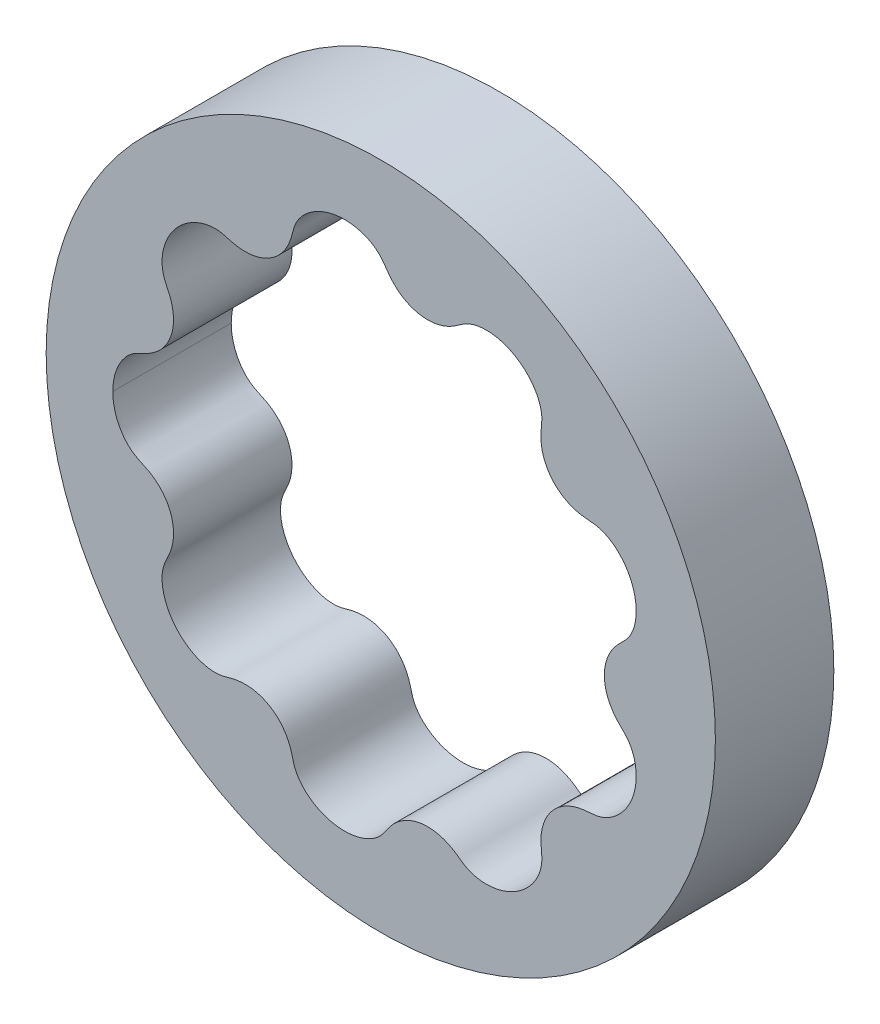
ISO-10303-21;
HEADER;
FILE_DESCRIPTION(('STEP AP214'),'2;1');
FILE_NAME('part.step','',(''),(''),'','','');
FILE_SCHEMA(('AUTOMOTIVE_DESIGN { 1 0 10303 214 1 1 1 1 }'));
ENDSEC;
DATA;
#1=APPLICATION_CONTEXT('core data for automotive mechanical design processes');
#2=APPLICATION_PROTOCOL_DEFINITION('international standard','automotive_design',2000,#1);
#3=PRODUCT_CONTEXT('',#1,'mechanical');
#4=PRODUCT('Part','Part','',(#3));
#5=PRODUCT_RELATED_PRODUCT_CATEGORY('part','',(#4));
#6=PRODUCT_DEFINITION_FORMATION('','',#4);
#7=PRODUCT_DEFINITION_CONTEXT('part definition',#1,'design');
#8=PRODUCT_DEFINITION('design','',#6,#7);
#9=PRODUCT_DEFINITION_SHAPE('','',#8);
#10=(LENGTH_UNIT() NAMED_UNIT(*) SI_UNIT(.MILLI.,.METRE.));
#11=(NAMED_UNIT(*) PLANE_ANGLE_UNIT() SI_UNIT($,.RADIAN.));
#12=(NAMED_UNIT(*) SI_UNIT($,.STERADIAN.) SOLID_ANGLE_UNIT());
#13=UNCERTAINTY_MEASURE_WITH_UNIT(LENGTH_MEASURE(1.E-05),#10,'distance_accuracy_value','');
#14=(GEOMETRIC_REPRESENTATION_CONTEXT(3) GLOBAL_UNCERTAINTY_ASSIGNED_CONTEXT((#13)) GLOBAL_UNIT_ASSIGNED_CONTEXT((#10,
#11,#12)) REPRESENTATION_CONTEXT('',''));
#15=CARTESIAN_POINT('',(0.,0.,0.));
#16=DIRECTION('',(0.,0.,1.));
#17=DIRECTION('',(1.,0.,0.));
#18=AXIS2_PLACEMENT_3D('',#15,#16,#17);
#19=CARTESIAN_POINT('',(0.,0.,4.));
#20=DIRECTION('',(0.,0.,1.));
#21=DIRECTION('',(1.,0.,0.));
#22=AXIS2_PLACEMENT_3D('',#19,#20,#21);
#23=PLANE('',#22);
#24=CARTESIAN_POINT('',(0.,0.,4.));
#25=DIRECTION('',(0.,0.,1.));
#26=DIRECTION('',(1.,0.,0.));
#27=AXIS2_PLACEMENT_3D('',#24,#25,#26);
#28=CIRCLE('',#27,11.3);
#29=CARTESIAN_POINT('',(11.3,0.,4.));
#30=VERTEX_POINT('',#29);
#31=EDGE_CURVE('E11',#30,#30,#28,.T.);
#32=ORIENTED_EDGE('',*,*,#31,.T.);
#33=EDGE_LOOP('',(#32));
#34=FACE_BOUND('',#33,.T.);
#35=CARTESIAN_POINT('',(-9.05,4.34208598569843E-12,4.));
#36=CARTESIAN_POINT('',(-9.05000000000009,-0.0338845457485466,4.));
#37=CARTESIAN_POINT('',(-9.0480108330893,-0.0999754638575466,4.));
#38=CARTESIAN_POINT('',(-9.03849618641108,-0.253381349152992,4.));
#39=CARTESIAN_POINT('',(-9.01161834121665,-0.402056601440044,4.));
#40=CARTESIAN_POINT('',(-8.96818608965087,-0.584253865791187,4.));
#41=CARTESIAN_POINT('',(-8.90628150530137,-0.753480861616977,4.));
#42=CARTESIAN_POINT('',(-8.82464560083271,-0.928393679765872,4.));
#43=CARTESIAN_POINT('',(-8.72205328204634,-1.09550990602707,4.));
#44=CARTESIAN_POINT('',(-8.59255305961778,-1.25815337939472,4.));
#45=CARTESIAN_POINT('',(-8.43427689913171,-1.40817021879999,4.));
#46=CARTESIAN_POINT('',(-8.22379434202984,-1.54385861169105,4.));
#47=CARTESIAN_POINT('',(-7.96175769623347,-1.64361375906756,4.));
#48=CARTESIAN_POINT('',(-7.67491557586151,-1.80488701473293,4.));
#49=CARTESIAN_POINT('',(-7.38880714459647,-2.05246447300622,4.));
#50=CARTESIAN_POINT('',(-7.16387052284104,-2.37305520053106,4.));
#51=CARTESIAN_POINT('',(-7.02294453567574,-2.75014551002979,4.));
#52=CARTESIAN_POINT('',(-6.98370366084114,-3.11056598882183,4.));
#53=CARTESIAN_POINT('',(-7.01650645467619,-3.43029150072726,4.));
#54=CARTESIAN_POINT('',(-7.08818605320103,-3.67823618533869,4.));
#55=CARTESIAN_POINT('',(-7.16312462348558,-3.85880815844515,4.));
#56=CARTESIAN_POINT('',(-7.2500269078327,-4.0339149857726,4.));
#57=CARTESIAN_POINT('',(-7.34496135371445,-4.23988161683626,4.));
#58=CARTESIAN_POINT('',(-7.40485279120046,-4.55150918978985,4.));
#59=CARTESIAN_POINT('',(-7.37966982275361,-4.92997010947759,4.));
#60=CARTESIAN_POINT('',(-7.25886645405434,-5.32011743441312,4.));
#61=CARTESIAN_POINT('',(-7.05984177791175,-5.67488836434194,4.));
#62=CARTESIAN_POINT('',(-6.8146038549447,-5.96715365862774,4.));
#63=CARTESIAN_POINT('',(-6.49978012510001,-6.22475847184485,4.));
#64=CARTESIAN_POINT('',(-6.1365416607677,-6.41147671768762,4.));
#65=CARTESIAN_POINT('',(-5.76819685028252,-6.50199385185095,4.));
#66=CARTESIAN_POINT('',(-5.45091280943954,-6.4971288982848,4.));
#67=CARTESIAN_POINT('',(-5.2315757924767,-6.43939791211182,4.));
#68=CARTESIAN_POINT('',(-5.04406860228578,-6.38423217623337,4.));
#69=CARTESIAN_POINT('',(-4.853163254691,-6.34176822433269,4.));
#70=CARTESIAN_POINT('',(-4.59664492576909,-6.31426590279636,4.));
#71=CARTESIAN_POINT('',(-4.27592450333769,-6.33743270329501,4.));
#72=CARTESIAN_POINT('',(-3.93716764740486,-6.43607692048365,4.));
#73=CARTESIAN_POINT('',(-3.60522228785027,-6.62772565796741,4.));
#74=CARTESIAN_POINT('',(-3.35041546705783,-6.87177560091479,4.));
#75=CARTESIAN_POINT('',(-3.16999221076395,-7.13794422226942,4.));
#76=CARTESIAN_POINT('',(-3.06555076730631,-7.3738467911592,4.));
#77=CARTESIAN_POINT('',(-3.00687293362705,-7.5604076150529,4.));
#78=CARTESIAN_POINT('',(-2.96089430468505,-7.75037653148983,4.));
#79=CARTESIAN_POINT('',(-2.90122223151202,-7.96919335153971,4.));
#80=CARTESIAN_POINT('',(-2.74679349993018,-8.2464020477215,4.));
#81=CARTESIAN_POINT('',(-2.48423076735979,-8.52013914852142,4.));
#82=CARTESIAN_POINT('',(-2.14090909672855,-8.74135423950637,4.));
#83=CARTESIAN_POINT('',(-1.76040443238665,-8.88519642226108,4.));
#84=CARTESIAN_POINT('',(-1.38467709910732,-8.95144728852439,4.));
#85=CARTESIAN_POINT('',(-0.977922749887494,-8.94642011062799,4.));
#86=CARTESIAN_POINT('',(-0.579645892311698,-8.8559688490739,4.));
#87=CARTESIAN_POINT('',(-0.239294027580617,-8.68854185876272,4.));
#88=CARTESIAN_POINT('',(0.000632469936170721,-8.48086862956355,4.));
#89=CARTESIAN_POINT('',(0.131545636898317,-8.29565712930711,4.));
#90=CARTESIAN_POINT('',(0.239724611301174,-8.13287035796854,4.));
#91=CARTESIAN_POINT('',(0.358671298243356,-7.97762952875283,4.));
#92=CARTESIAN_POINT('',(0.537497582550544,-7.79167470427905,4.));
#93=CARTESIAN_POINT('',(0.79807501489091,-7.60326640099559,4.));
#94=CARTESIAN_POINT('',(1.12098510094963,-7.4610835387521,4.));
#95=CARTESIAN_POINT('',(1.49845943391574,-7.3945246293248,4.));
#96=CARTESIAN_POINT('',(1.85052506188594,-7.41769106186328,4.));
#97=CARTESIAN_POINT('',(2.15982718709108,-7.5056142233956,4.));
#98=CARTESIAN_POINT('',(2.39146922257779,-7.61919240836647,4.));
#99=CARTESIAN_POINT('',(2.55633803721866,-7.72438890710487,4.));
#100=CARTESIAN_POINT('',(2.71366937606111,-7.84035904657062,4.));
#101=CARTESIAN_POINT('',(2.90003357686985,-7.96962598650576,4.));
#102=CARTESIAN_POINT('',(3.19651916375521,-8.08271529247329,4.));
#103=CARTESIAN_POINT('',(3.57360870270002,-8.12363800619546,4.));
#104=CARTESIAN_POINT('',(3.97880268029327,-8.07241568136682,4.));
#105=CARTESIAN_POINT('',(4.36274613673875,-7.93802150242619,4.));
#106=CARTESIAN_POINT('',(4.69315520862735,-7.7472597360533,4.));
#107=CARTESIAN_POINT('',(5.00151570965813,-7.48195203825989,4.));
#108=CARTESIAN_POINT('',(5.24847253342773,-7.15665492310951,4.));
#109=CARTESIAN_POINT('',(5.40157719257482,-6.80962444532587,4.));
#110=CARTESIAN_POINT('',(5.4518817750752,-6.49631574320234,4.));
#111=CARTESIAN_POINT('',(5.4331154201998,-6.27028613951449,4.));
#112=CARTESIAN_POINT('',(5.41134800574038,-6.0760481365708,4.));
#113=CARTESIAN_POINT('',(5.40267956638729,-5.88066929893342,4.));
#114=CARTESIAN_POINT('',(5.4201390013375,-5.62327233003758,4.));
#115=CARTESIAN_POINT('',(5.49864635662003,-5.31144723525566,4.));
#116=CARTESIAN_POINT('',(5.65461647568074,-4.99496626597723,4.));
#117=CARTESIAN_POINT('',(5.90099531095603,-4.70134332075604,4.));
#118=CARTESIAN_POINT('',(6.1855843842221,-4.4927864748549,4.));
#119=CARTESIAN_POINT('',(6.47903937794905,-4.36132384924646,4.));
#120=CARTESIAN_POINT('',(6.7294942961724,-4.29943333371457,4.));
#121=CARTESIAN_POINT('',(6.92340982368915,-4.27404257217982,4.));
#122=CARTESIAN_POINT('',(7.11847736507471,-4.26175080301141,4.));
#123=CARTESIAN_POINT('',(7.34433080736584,-4.24098140233228,4.));
#124=CARTESIAN_POINT('',(7.64414612926106,-4.13703738102555,4.));
#125=CARTESIAN_POINT('',(7.95931515564262,-3.92599456019099,4.));
#126=CARTESIAN_POINT('',(8.23679143100652,-3.62630702822289,4.));
#127=CARTESIAN_POINT('',(8.44322684601852,-3.27872194257295,4.));
#128=CARTESIAN_POINT('',(8.57256056481669,-2.92522878255192,4.));
#129=CARTESIAN_POINT('',(8.63998002290509,-2.52542727922476,4.));
#130=CARTESIAN_POINT('',(8.62280091236429,-2.1212000603798,4.));
#131=CARTESIAN_POINT('',(8.52117396998677,-1.76029674907265,4.));
#132=CARTESIAN_POINT('',(8.3634633135826,-1.48950364190572,4.));
#133=CARTESIAN_POINT('',(8.21390626106284,-1.33110870093092,4.));
#134=CARTESIAN_POINT('',(8.07436723837733,-1.19947756070688,4.));
#135=CARTESIAN_POINT('',(7.93834343482174,-1.05611945374247,4.));
#136=CARTESIAN_POINT('',(7.80974701267406,-0.886363911294823,4.));
#137=CARTESIAN_POINT('',(7.69959982716471,-0.686174715248969,4.));
#138=CARTESIAN_POINT('',(7.63179107421368,-0.513440089414267,4.));
#139=CARTESIAN_POINT('',(7.59278548068211,-0.374358830302239,4.));
#140=CARTESIAN_POINT('',(7.56916783899256,-0.254768484757351,4.));
#141=CARTESIAN_POINT('',(7.55603575821335,-0.154882157840738,4.));
#142=CARTESIAN_POINT('',(7.55109737708745,-0.0666034399658314,4.));
#143=CARTESIAN_POINT('',(7.55000000000025,-0.0222174664717109,4.));
#144=CARTESIAN_POINT('',(7.55,-1.3359856241198E-11,4.));
#145=B_SPLINE_CURVE_WITH_KNOTS('',4,(#35,#36,#37,#38,#39,#40,#41,#42,#43,#44,#45,#46,#47,#48,
#49,#50,#51,#52,#53,#54,#55,#56,#57,#58,#59,#60,#61,#62,#63,#64,#65,#66,#67,#68,#69,#70,#71,#72,
#73,#74,#75,#76,#77,#78,#79,#80,#81,#82,#83,#84,#85,#86,#87,#88,#89,#90,#91,#92,#93,#94,#95,#96,
#97,#98,#99,#100,#101,#102,#103,#104,#105,#106,#107,#108,#109,#110,#111,#112,#113,#114,#115,
#116,#117,#118,#119,#120,#121,#122,#123,#124,#125,#126,#127,#128,#129,#130,#131,#132,#133,#134,
#135,#136,#137,#138,#139,#140,#141,#142,#143,#144),.UNSPECIFIED.,.F.,.F.,(5,1,1,1,1,1,1,1,1,1,1,
1,1,1,1,1,1,1,1,1,1,1,1,1,1,1,1,1,1,1,1,1,1,1,1,1,1,1,1,1,1,1,1,1,1,1,1,1,1,1,1,1,1,1,1,1,1,1,1,
1,1,1,1,1,1,1,1,1,1,1,1,1,1,1,1,1,1,1,1,1,1,1,1,1,1,1,1,1,1,1,1,1,1,1,1,1,1,1,1,1,1,1,1,1,1,1,
5),(0.0652033425962136,0.0696067762717131,0.0740102099472127,0.0792347884678217,
0.0844593669884307,0.0896839455090396,0.0949085240296486,0.100807291678031,0.106706059326413,
0.113107795366628,0.119509531406844,0.128934262178931,0.138358992951017,0.150165223947531,
0.161982616798153,0.172732891824195,0.183462449964343,0.190799304051377,0.198136158138412,
0.201842380228175,0.205548602317939,0.212961046497466,0.223694446923218,0.237304279166519,
0.248033097158145,0.258761915149772,0.269490733141396,0.28021955113302,0.293829383376316,
0.304562783802064,0.311975227981587,0.315681450071349,0.319387672161111,0.326724526248143,
0.334061380335175,0.344790938475318,0.355541213501353,0.366291488527385,0.377021046667528,
0.384357900754559,0.391694754841591,0.395400976931353,0.399107199021114,0.406519643200637,
0.417253043626384,0.430862875869679,0.4415916938613,0.452320511852922,0.463049329844543,
0.473778147836164,0.48738798007946,0.498121380505208,0.505533824684732,0.509240046774494,
0.512946268864256,0.520283122951288,0.52761997703832,0.538349535178464,0.549099810204498,
0.559850085230529,0.57057964337067,0.577916497457702,0.585253351544733,0.588959573634495,
0.592665795724256,0.600078239903779,0.610811640329526,0.62442147257282,0.635150290564441,
0.645879108556062,0.656607926547684,0.667336744539306,0.680946576782601,0.691679977208348,
0.699092421387871,0.702798643477633,0.706504865567395,0.713841719654426,0.721178573741458,
0.731908131881601,0.742658406907635,0.753408681933668,0.764138240073811,0.771475094160842,
0.778811948247874,0.782518170337635,0.786224392427397,0.79363683660692,0.804370237032666,
0.817980069275961,0.828708887267582,0.839437705259203,0.849882621646104,0.860327538033005,
0.874366170725934,0.884812242774694,0.891865721209106,0.895392460426312,0.898919199643518,
0.906554070350569,0.914188941057619,0.919428463542016,0.924667986026414,0.927555235592,
0.930442485157586,0.933329734723172,0.936216984288758),.UNSPECIFIED.);
#146=CARTESIAN_POINT('',(-9.05,4.34208598569843E-12,4.));
#147=VERTEX_POINT('',#146);
#148=CARTESIAN_POINT('',(7.55,-1.3359856241198E-11,4.));
#149=VERTEX_POINT('',#148);
#150=EDGE_CURVE('E76',#147,#149,#145,.T.);
#151=ORIENTED_EDGE('',*,*,#150,.F.);
#152=CARTESIAN_POINT('',(7.55,0.,4.));
#153=CARTESIAN_POINT('',(7.55000000000027,0.022217466458351,4.));
#154=CARTESIAN_POINT('',(7.55109737708752,0.0666034399524704,4.));
#155=CARTESIAN_POINT('',(7.55603575821352,0.154882157827372,4.));
#156=CARTESIAN_POINT('',(7.56916783899283,0.254768484743971,4.));
#157=CARTESIAN_POINT('',(7.5927854806825,0.374358830288833,4.));
#158=CARTESIAN_POINT('',(7.63179107421422,0.51344008940082,4.));
#159=CARTESIAN_POINT('',(7.69959982716544,0.68617471523545,4.));
#160=CARTESIAN_POINT('',(7.80974701267501,0.886363911281186,4.));
#161=CARTESIAN_POINT('',(7.93834343482286,1.0561194537287,4.));
#162=CARTESIAN_POINT('',(8.0743672383786,1.19947756069296,4.));
#163=CARTESIAN_POINT('',(8.21390626106425,1.33110870091685,4.));
#164=CARTESIAN_POINT('',(8.36346331358419,1.4895036418915,4.));
#165=CARTESIAN_POINT('',(8.52117396998865,1.76029674905826,4.));
#166=CARTESIAN_POINT('',(8.62280091236655,2.12120006036529,4.));
#167=CARTESIAN_POINT('',(8.63998002290779,2.52542727921024,4.));
#168=CARTESIAN_POINT('',(8.57256056481981,2.92522878253747,4.));
#169=CARTESIAN_POINT('',(8.44322684602201,3.27872194255863,4.));
#170=CARTESIAN_POINT('',(8.23679143101039,3.62630702820879,4.));
#171=CARTESIAN_POINT('',(7.95931515564681,3.92599456017719,4.));
#172=CARTESIAN_POINT('',(7.64414612926547,4.13703738101209,4.));
#173=CARTESIAN_POINT('',(7.34433080737036,4.24098140231914,4.));
#174=CARTESIAN_POINT('',(7.11847736507926,4.26175080299851,4.));
#175=CARTESIAN_POINT('',(6.92340982369371,4.27404257216713,4.));
#176=CARTESIAN_POINT('',(6.72949429617699,4.29943333370208,4.));
#177=CARTESIAN_POINT('',(6.4790393779537,4.36132384923424,4.));
#178=CARTESIAN_POINT('',(6.18558438422689,4.49278647484299,4.));
#179=CARTESIAN_POINT('',(5.90099531096105,4.70134332074444,4.));
#180=CARTESIAN_POINT('',(5.65461647568606,4.99496626596589,4.));
#181=CARTESIAN_POINT('',(5.49864635662569,5.31144723524449,4.));
#182=CARTESIAN_POINT('',(5.4201390013435,5.62327233002649,4.));
#183=CARTESIAN_POINT('',(5.40267956639356,5.88066929892235,4.));
#184=CARTESIAN_POINT('',(5.41134800574686,6.07604813655972,4.));
#185=CARTESIAN_POINT('',(5.43311542020648,6.27028613950339,4.));
#186=CARTESIAN_POINT('',(5.45188177508213,6.49631574319122,4.));
#187=CARTESIAN_POINT('',(5.40157719258208,6.8096244453148,4.));
#188=CARTESIAN_POINT('',(5.24847253343536,7.1566549230986,4.));
#189=CARTESIAN_POINT('',(5.0015157096661,7.48195203824925,4.));
#190=CARTESIAN_POINT('',(4.69315520863561,7.74725973604298,4.));
#191=CARTESIAN_POINT('',(4.36274613674722,7.93802150241623,4.));
#192=CARTESIAN_POINT('',(3.97880268030188,8.07241568135727,4.));
#193=CARTESIAN_POINT('',(3.57360870270868,8.12363800618634,4.));
#194=CARTESIAN_POINT('',(3.19651916376383,8.08271529246457,4.));
#195=CARTESIAN_POINT('',(2.90003357687835,7.96962598649736,4.));
#196=CARTESIAN_POINT('',(2.71366937606947,7.84035904656242,4.));
#197=CARTESIAN_POINT('',(2.5563380372269,7.72438890709684,4.));
#198=CARTESIAN_POINT('',(2.39146922258591,7.61919240835861,4.));
#199=CARTESIAN_POINT('',(2.15982718709908,7.50561422338799,4.));
#200=CARTESIAN_POINT('',(1.85052506189385,7.41769106185599,4.));
#201=CARTESIAN_POINT('',(1.49845943392362,7.3945246293179,4.));
#202=CARTESIAN_POINT('',(1.12098510095759,7.4610835387456,4.));
#203=CARTESIAN_POINT('',(0.798075014899017,7.60326640098943,4.));
#204=CARTESIAN_POINT('',(0.537497582558851,7.79167470427317,4.));
#205=CARTESIAN_POINT('',(0.358671298251862,7.97762952874714,4.));
#206=CARTESIAN_POINT('',(0.239724611309845,8.13287035796297,4.));
#207=CARTESIAN_POINT('',(0.131545636907162,8.29565712930166,4.));
#208=CARTESIAN_POINT('',(0.000632469945212832,8.48086862955824,4.));
#209=CARTESIAN_POINT('',(-0.239294027571354,8.68854185875767,4.));
#210=CARTESIAN_POINT('',(-0.579645892302256,8.85596884906921,4.));
#211=CARTESIAN_POINT('',(-0.977922749877955,8.94642011062372,4.));
#212=CARTESIAN_POINT('',(-1.38467709909778,8.95144728852055,4.));
#213=CARTESIAN_POINT('',(-1.76040443237717,8.88519642225764,4.));
#214=CARTESIAN_POINT('',(-2.14090909671924,8.74135423950334,4.));
#215=CARTESIAN_POINT('',(-2.4842307673507,8.52013914851876,4.));
#216=CARTESIAN_POINT('',(-2.74679349992139,8.24640204771912,4.));
#217=CARTESIAN_POINT('',(-2.90122223150353,7.9691933515375,4.));
#218=CARTESIAN_POINT('',(-2.96089430467679,7.75037653148768,4.));
#219=CARTESIAN_POINT('',(-3.00687293361899,7.5604076150508,4.));
#220=CARTESIAN_POINT('',(-3.06555076729845,7.37384679115716,4.));
#221=CARTESIAN_POINT('',(-3.16999221075634,7.13794422226749,4.));
#222=CARTESIAN_POINT('',(-3.3504154670505,6.87177560091305,4.));
#223=CARTESIAN_POINT('',(-3.60522228784321,6.62772565796595,4.));
#224=CARTESIAN_POINT('',(-3.937167647398,6.43607692048254,4.));
#225=CARTESIAN_POINT('',(-4.27592450333094,6.33743270329426,4.));
#226=CARTESIAN_POINT('',(-4.59664492576236,6.31426590279595,4.));
#227=CARTESIAN_POINT('',(-4.85316325468424,6.34176822433256,4.));
#228=CARTESIAN_POINT('',(-5.04406860227897,6.38423217623344,4.));
#229=CARTESIAN_POINT('',(-5.23157579246983,6.43939791211209,4.));
#230=CARTESIAN_POINT('',(-5.45091280943261,6.49712889828531,4.));
#231=CARTESIAN_POINT('',(-5.76819685027559,6.50199385185179,4.));
#232=CARTESIAN_POINT('',(-6.13654166076087,6.41147671768886,4.));
#233=CARTESIAN_POINT('',(-6.49978012509337,6.22475847184648,4.));
#234=CARTESIAN_POINT('',(-6.81460385493834,5.9671536586297,4.));
#235=CARTESIAN_POINT('',(-7.0598417779057,5.67488836434416,4.));
#236=CARTESIAN_POINT('',(-7.25886645404867,5.32011743441555,4.));
#237=CARTESIAN_POINT('',(-7.37966982274836,4.92997010948015,4.));
#238=CARTESIAN_POINT('',(-7.40485279119561,4.55150918979244,4.));
#239=CARTESIAN_POINT('',(-7.34496135370993,4.23988161683878,4.));
#240=CARTESIAN_POINT('',(-7.2500269078284,4.03391498577502,4.));
#241=CARTESIAN_POINT('',(-7.16312462348147,3.85880815844748,4.));
#242=CARTESIAN_POINT('',(-7.08818605319711,3.67823618534094,4.));
#243=CARTESIAN_POINT('',(-7.01650645467254,3.43029150072943,4.));
#244=CARTESIAN_POINT('',(-6.98370366083783,3.11056598882397,4.));
#245=CARTESIAN_POINT('',(-7.02294453567281,2.75014551003197,4.));
#246=CARTESIAN_POINT('',(-7.16387052283851,2.3730552005334,4.));
#247=CARTESIAN_POINT('',(-7.38880714459428,2.05246447300879,4.));
#248=CARTESIAN_POINT('',(-7.67491557585959,1.80488701473581,4.));
#249=CARTESIAN_POINT('',(-7.96175769623171,1.64361375907074,4.));
#250=CARTESIAN_POINT('',(-8.2237943420282,1.54385861169451,4.));
#251=CARTESIAN_POINT('',(-8.43427689913021,1.40817021880368,4.));
#252=CARTESIAN_POINT('',(-8.59255305961644,1.25815337939858,4.));
#253=CARTESIAN_POINT('',(-8.72205328204517,1.09550990603106,4.));
#254=CARTESIAN_POINT('',(-8.82464560083173,0.928393679769974,4.));
#255=CARTESIAN_POINT('',(-8.90628150530056,0.753480861621166,4.));
#256=CARTESIAN_POINT('',(-8.96818608965025,0.584253865795442,4.));
#257=CARTESIAN_POINT('',(-9.01161834121622,0.402056601444345,4.));
#258=CARTESIAN_POINT('',(-9.03849618641081,0.253381349157321,4.));
#259=CARTESIAN_POINT('',(-9.0480108330892,0.0999754638618866,4.));
#260=CARTESIAN_POINT('',(-9.05000000000006,0.0338845457528887,4.));
#261=CARTESIAN_POINT('',(-9.05,0.,4.));
#262=B_SPLINE_CURVE_WITH_KNOTS('',4,(#152,#153,#154,#155,#156,#157,#158,#159,#160,#161,#162,
#163,#164,#165,#166,#167,#168,#169,#170,#171,#172,#173,#174,#175,#176,#177,#178,#179,#180,#181,
#182,#183,#184,#185,#186,#187,#188,#189,#190,#191,#192,#193,#194,#195,#196,#197,#198,#199,#200,
#201,#202,#203,#204,#205,#206,#207,#208,#209,#210,#211,#212,#213,#214,#215,#216,#217,#218,#219,
#220,#221,#222,#223,#224,#225,#226,#227,#228,#229,#230,#231,#232,#233,#234,#235,#236,#237,#238,
#239,#240,#241,#242,#243,#244,#245,#246,#247,#248,#249,#250,#251,#252,#253,#254,#255,#256,#257,
#258,#259,#260,#261),.UNSPECIFIED.,.F.,.F.,(5,1,1,1,1,1,1,1,1,1,1,1,1,1,1,1,1,1,1,1,1,1,1,1,1,1,
1,1,1,1,1,1,1,1,1,1,1,1,1,1,1,1,1,1,1,1,1,1,1,1,1,1,1,1,1,1,1,1,1,1,1,1,1,1,1,1,1,1,1,1,1,1,1,1,
1,1,1,1,1,1,1,1,1,1,1,1,1,1,1,1,1,1,1,1,1,1,1,1,1,1,1,1,1,1,1,1,5),(0.0652033425962136,
0.0680905921617996,0.0709778417273857,0.0738650912929718,0.0767523408585578,0.0819918633429553,
0.0872313858273528,0.094866256534403,0.102501127241453,0.106027866458659,0.109554605675866,
0.116608084110278,0.127054156159038,0.141092788851966,0.151537705238868,0.161982621625769,
0.17271143961739,0.183440257609011,0.197050089852305,0.207783490278052,0.215195934457575,
0.218902156547336,0.222608378637098,0.229945232724129,0.237282086811161,0.248011644951303,
0.258761919977337,0.269512195003371,0.280241753143513,0.287578607230545,0.294915461317577,
0.298621683407339,0.3023279054971,0.309740349676624,0.320473750102371,0.334083582345666,
0.344812400337288,0.35554121832891,0.36627003632053,0.376998854312151,0.390608686555446,
0.401342086981192,0.408754531160715,0.412460753250477,0.416166975340238,0.42350382942727,
0.430840683514301,0.441570241654443,0.452320516680474,0.463070791706508,0.473800349846651,
0.481137203933684,0.488474058020716,0.492180280110478,0.49588650220024,0.503298946379764,
0.514032346805512,0.527642179048808,0.538370997040429,0.54909981503205,0.559828633023671,
0.570557451015293,0.584167283258587,0.594900683684334,0.602313127863857,0.606019349953619,
0.609725572043381,0.617062426130412,0.624399280217444,0.635128838357586,0.645879113383619,
0.656629388409653,0.667358946549796,0.674695800636828,0.682032654723861,0.685738876813622,
0.689445098903384,0.696857543082908,0.707590943508655,0.721200775751951,0.731929593743576,
0.7426584117352,0.753387229726826,0.764116047718453,0.777725879961754,0.788459280387506,
0.795871724567033,0.799577946656796,0.80328416874656,0.810621022833594,0.817957876920628,
0.828687435060777,0.839437710086819,0.851255102937441,0.863061333933954,0.872486064706041,
0.881910795478128,0.888312531518343,0.894714267558559,0.900613035206941,0.906511802855323,
0.911736381375932,0.916960959896541,0.92218553841715,0.927410116937759,0.931813550613258,
0.936216984288758),.UNSPECIFIED.);
#263=EDGE_CURVE('E65',#149,#147,#262,.T.);
#264=ORIENTED_EDGE('',*,*,#263,.F.);
#265=EDGE_LOOP('',(#151,#264));
#266=FACE_BOUND('',#265,.T.);
#267=ADVANCED_FACE('F33',(#34,#266),#23,.T.);
#268=CARTESIAN_POINT('',(0.,0.,0.));
#269=DIRECTION('',(0.,0.,1.));
#270=DIRECTION('',(1.,0.,0.));
#271=AXIS2_PLACEMENT_3D('',#268,#269,#270);
#272=PLANE('',#271);
#273=CARTESIAN_POINT('',(0.,0.,0.));
#274=DIRECTION('',(0.,0.,1.));
#275=DIRECTION('',(1.,0.,0.));
#276=AXIS2_PLACEMENT_3D('',#273,#274,#275);
#277=CIRCLE('',#276,11.3);
#278=CARTESIAN_POINT('',(11.3,0.,0.));
#279=VERTEX_POINT('',#278);
#280=EDGE_CURVE('E37',#279,#279,#277,.T.);
#281=ORIENTED_EDGE('',*,*,#280,.F.);
#282=EDGE_LOOP('',(#281));
#283=FACE_BOUND('',#282,.T.);
#284=CARTESIAN_POINT('',(7.55,0.,0.));
#285=CARTESIAN_POINT('',(7.55000000000027,0.022217466458351,0.));
#286=CARTESIAN_POINT('',(7.55109737708752,0.0666034399524704,0.));
#287=CARTESIAN_POINT('',(7.55603575821352,0.154882157827372,0.));
#288=CARTESIAN_POINT('',(7.56916783899283,0.254768484743971,0.));
#289=CARTESIAN_POINT('',(7.5927854806825,0.374358830288833,0.));
#290=CARTESIAN_POINT('',(7.63179107421422,0.51344008940082,0.));
#291=CARTESIAN_POINT('',(7.69959982716544,0.68617471523545,0.));
#292=CARTESIAN_POINT('',(7.80974701267501,0.886363911281186,0.));
#293=CARTESIAN_POINT('',(7.93834343482286,1.0561194537287,0.));
#294=CARTESIAN_POINT('',(8.0743672383786,1.19947756069296,0.));
#295=CARTESIAN_POINT('',(8.21390626106425,1.33110870091685,0.));
#296=CARTESIAN_POINT('',(8.36346331358419,1.4895036418915,0.));
#297=CARTESIAN_POINT('',(8.52117396998865,1.76029674905826,0.));
#298=CARTESIAN_POINT('',(8.62280091236655,2.12120006036529,0.));
#299=CARTESIAN_POINT('',(8.63998002290779,2.52542727921024,0.));
#300=CARTESIAN_POINT('',(8.57256056481981,2.92522878253747,0.));
#301=CARTESIAN_POINT('',(8.44322684602201,3.27872194255863,0.));
#302=CARTESIAN_POINT('',(8.23679143101039,3.62630702820879,0.));
#303=CARTESIAN_POINT('',(7.95931515564681,3.92599456017719,0.));
#304=CARTESIAN_POINT('',(7.64414612926547,4.13703738101209,0.));
#305=CARTESIAN_POINT('',(7.34433080737036,4.24098140231914,0.));
#306=CARTESIAN_POINT('',(7.11847736507926,4.26175080299851,0.));
#307=CARTESIAN_POINT('',(6.92340982369371,4.27404257216713,0.));
#308=CARTESIAN_POINT('',(6.72949429617699,4.29943333370208,0.));
#309=CARTESIAN_POINT('',(6.4790393779537,4.36132384923424,0.));
#310=CARTESIAN_POINT('',(6.18558438422689,4.49278647484299,0.));
#311=CARTESIAN_POINT('',(5.90099531096105,4.70134332074444,0.));
#312=CARTESIAN_POINT('',(5.65461647568606,4.99496626596589,0.));
#313=CARTESIAN_POINT('',(5.49864635662569,5.31144723524449,0.));
#314=CARTESIAN_POINT('',(5.4201390013435,5.62327233002649,0.));
#315=CARTESIAN_POINT('',(5.40267956639356,5.88066929892235,0.));
#316=CARTESIAN_POINT('',(5.41134800574686,6.07604813655972,0.));
#317=CARTESIAN_POINT('',(5.43311542020648,6.27028613950339,0.));
#318=CARTESIAN_POINT('',(5.45188177508213,6.49631574319122,0.));
#319=CARTESIAN_POINT('',(5.40157719258208,6.8096244453148,0.));
#320=CARTESIAN_POINT('',(5.24847253343536,7.1566549230986,0.));
#321=CARTESIAN_POINT('',(5.0015157096661,7.48195203824925,0.));
#322=CARTESIAN_POINT('',(4.69315520863561,7.74725973604298,0.));
#323=CARTESIAN_POINT('',(4.36274613674722,7.93802150241623,0.));
#324=CARTESIAN_POINT('',(3.97880268030188,8.07241568135727,0.));
#325=CARTESIAN_POINT('',(3.57360870270868,8.12363800618634,0.));
#326=CARTESIAN_POINT('',(3.19651916376383,8.08271529246457,0.));
#327=CARTESIAN_POINT('',(2.90003357687835,7.96962598649736,0.));
#328=CARTESIAN_POINT('',(2.71366937606947,7.84035904656242,0.));
#329=CARTESIAN_POINT('',(2.5563380372269,7.72438890709684,0.));
#330=CARTESIAN_POINT('',(2.39146922258591,7.61919240835861,0.));
#331=CARTESIAN_POINT('',(2.15982718709908,7.50561422338799,0.));
#332=CARTESIAN_POINT('',(1.85052506189385,7.41769106185599,0.));
#333=CARTESIAN_POINT('',(1.49845943392362,7.3945246293179,0.));
#334=CARTESIAN_POINT('',(1.12098510095759,7.4610835387456,0.));
#335=CARTESIAN_POINT('',(0.798075014899017,7.60326640098943,0.));
#336=CARTESIAN_POINT('',(0.537497582558851,7.79167470427317,0.));
#337=CARTESIAN_POINT('',(0.358671298251862,7.97762952874714,0.));
#338=CARTESIAN_POINT('',(0.239724611309845,8.13287035796297,0.));
#339=CARTESIAN_POINT('',(0.131545636907162,8.29565712930166,0.));
#340=CARTESIAN_POINT('',(0.000632469945212832,8.48086862955824,0.));
#341=CARTESIAN_POINT('',(-0.239294027571354,8.68854185875767,0.));
#342=CARTESIAN_POINT('',(-0.579645892302256,8.85596884906921,0.));
#343=CARTESIAN_POINT('',(-0.977922749877955,8.94642011062372,0.));
#344=CARTESIAN_POINT('',(-1.38467709909778,8.95144728852055,0.));
#345=CARTESIAN_POINT('',(-1.76040443237717,8.88519642225764,0.));
#346=CARTESIAN_POINT('',(-2.14090909671924,8.74135423950334,0.));
#347=CARTESIAN_POINT('',(-2.4842307673507,8.52013914851876,0.));
#348=CARTESIAN_POINT('',(-2.74679349992139,8.24640204771912,0.));
#349=CARTESIAN_POINT('',(-2.90122223150353,7.9691933515375,0.));
#350=CARTESIAN_POINT('',(-2.96089430467679,7.75037653148768,0.));
#351=CARTESIAN_POINT('',(-3.00687293361899,7.5604076150508,0.));
#352=CARTESIAN_POINT('',(-3.06555076729845,7.37384679115716,0.));
#353=CARTESIAN_POINT('',(-3.16999221075634,7.13794422226749,0.));
#354=CARTESIAN_POINT('',(-3.3504154670505,6.87177560091305,0.));
#355=CARTESIAN_POINT('',(-3.60522228784321,6.62772565796595,0.));
#356=CARTESIAN_POINT('',(-3.937167647398,6.43607692048254,0.));
#357=CARTESIAN_POINT('',(-4.27592450333094,6.33743270329426,0.));
#358=CARTESIAN_POINT('',(-4.59664492576236,6.31426590279595,0.));
#359=CARTESIAN_POINT('',(-4.85316325468424,6.34176822433256,0.));
#360=CARTESIAN_POINT('',(-5.04406860227897,6.38423217623344,0.));
#361=CARTESIAN_POINT('',(-5.23157579246983,6.43939791211209,0.));
#362=CARTESIAN_POINT('',(-5.45091280943261,6.49712889828531,0.));
#363=CARTESIAN_POINT('',(-5.76819685027559,6.50199385185179,0.));
#364=CARTESIAN_POINT('',(-6.13654166076087,6.41147671768886,0.));
#365=CARTESIAN_POINT('',(-6.49978012509337,6.22475847184648,0.));
#366=CARTESIAN_POINT('',(-6.81460385493834,5.9671536586297,0.));
#367=CARTESIAN_POINT('',(-7.0598417779057,5.67488836434416,0.));
#368=CARTESIAN_POINT('',(-7.25886645404867,5.32011743441555,0.));
#369=CARTESIAN_POINT('',(-7.37966982274836,4.92997010948015,0.));
#370=CARTESIAN_POINT('',(-7.40485279119561,4.55150918979244,0.));
#371=CARTESIAN_POINT('',(-7.34496135370993,4.23988161683878,0.));
#372=CARTESIAN_POINT('',(-7.2500269078284,4.03391498577502,0.));
#373=CARTESIAN_POINT('',(-7.16312462348147,3.85880815844748,0.));
#374=CARTESIAN_POINT('',(-7.08818605319711,3.67823618534094,0.));
#375=CARTESIAN_POINT('',(-7.01650645467254,3.43029150072943,0.));
#376=CARTESIAN_POINT('',(-6.98370366083783,3.11056598882397,0.));
#377=CARTESIAN_POINT('',(-7.02294453567281,2.75014551003197,0.));
#378=CARTESIAN_POINT('',(-7.16387052283851,2.3730552005334,0.));
#379=CARTESIAN_POINT('',(-7.38880714459428,2.05246447300879,0.));
#380=CARTESIAN_POINT('',(-7.67491557585959,1.80488701473581,0.));
#381=CARTESIAN_POINT('',(-7.96175769623171,1.64361375907074,0.));
#382=CARTESIAN_POINT('',(-8.2237943420282,1.54385861169451,0.));
#383=CARTESIAN_POINT('',(-8.43427689913021,1.40817021880368,0.));
#384=CARTESIAN_POINT('',(-8.59255305961644,1.25815337939858,0.));
#385=CARTESIAN_POINT('',(-8.72205328204517,1.09550990603106,0.));
#386=CARTESIAN_POINT('',(-8.82464560083173,0.928393679769974,0.));
#387=CARTESIAN_POINT('',(-8.90628150530056,0.753480861621166,0.));
#388=CARTESIAN_POINT('',(-8.96818608965025,0.584253865795442,0.));
#389=CARTESIAN_POINT('',(-9.01161834121622,0.402056601444345,0.));
#390=CARTESIAN_POINT('',(-9.03849618641081,0.253381349157321,0.));
#391=CARTESIAN_POINT('',(-9.0480108330892,0.0999754638618866,0.));
#392=CARTESIAN_POINT('',(-9.05000000000006,0.0338845457528887,0.));
#393=CARTESIAN_POINT('',(-9.05,0.,0.));
#394=B_SPLINE_CURVE_WITH_KNOTS('',4,(#284,#285,#286,#287,#288,#289,#290,#291,#292,#293,#294,
#295,#296,#297,#298,#299,#300,#301,#302,#303,#304,#305,#306,#307,#308,#309,#310,#311,#312,#313,
#314,#315,#316,#317,#318,#319,#320,#321,#322,#323,#324,#325,#326,#327,#328,#329,#330,#331,#332,
#333,#334,#335,#336,#337,#338,#339,#340,#341,#342,#343,#344,#345,#346,#347,#348,#349,#350,#351,
#352,#353,#354,#355,#356,#357,#358,#359,#360,#361,#362,#363,#364,#365,#366,#367,#368,#369,#370,
#371,#372,#373,#374,#375,#376,#377,#378,#379,#380,#381,#382,#383,#384,#385,#386,#387,#388,#389,
#390,#391,#392,#393),.UNSPECIFIED.,.F.,.F.,(5,1,1,1,1,1,1,1,1,1,1,1,1,1,1,1,1,1,1,1,1,1,1,1,1,1,
1,1,1,1,1,1,1,1,1,1,1,1,1,1,1,1,1,1,1,1,1,1,1,1,1,1,1,1,1,1,1,1,1,1,1,1,1,1,1,1,1,1,1,1,1,1,1,1,
1,1,1,1,1,1,1,1,1,1,1,1,1,1,1,1,1,1,1,1,1,1,1,1,1,1,1,1,1,1,1,1,5),(0.0652033425962136,
0.0680905921617996,0.0709778417273857,0.0738650912929718,0.0767523408585578,0.0819918633429553,
0.0872313858273528,0.094866256534403,0.102501127241453,0.106027866458659,0.109554605675866,
0.116608084110278,0.127054156159038,0.141092788851966,0.151537705238868,0.161982621625769,
0.17271143961739,0.183440257609011,0.197050089852305,0.207783490278052,0.215195934457575,
0.218902156547336,0.222608378637098,0.229945232724129,0.237282086811161,0.248011644951303,
0.258761919977337,0.269512195003371,0.280241753143513,0.287578607230545,0.294915461317577,
0.298621683407339,0.3023279054971,0.309740349676624,0.320473750102371,0.334083582345666,
0.344812400337288,0.35554121832891,0.36627003632053,0.376998854312151,0.390608686555446,
0.401342086981192,0.408754531160715,0.412460753250477,0.416166975340238,0.42350382942727,
0.430840683514301,0.441570241654443,0.452320516680474,0.463070791706508,0.473800349846651,
0.481137203933684,0.488474058020716,0.492180280110478,0.49588650220024,0.503298946379764,
0.514032346805512,0.527642179048808,0.538370997040429,0.54909981503205,0.559828633023671,
0.570557451015293,0.584167283258587,0.594900683684334,0.602313127863857,0.606019349953619,
0.609725572043381,0.617062426130412,0.624399280217444,0.635128838357586,0.645879113383619,
0.656629388409653,0.667358946549796,0.674695800636828,0.682032654723861,0.685738876813622,
0.689445098903384,0.696857543082908,0.707590943508655,0.721200775751951,0.731929593743576,
0.7426584117352,0.753387229726826,0.764116047718453,0.777725879961754,0.788459280387506,
0.795871724567033,0.799577946656796,0.80328416874656,0.810621022833594,0.817957876920628,
0.828687435060777,0.839437710086819,0.851255102937441,0.863061333933954,0.872486064706041,
0.881910795478128,0.888312531518343,0.894714267558559,0.900613035206941,0.906511802855323,
0.911736381375932,0.916960959896541,0.92218553841715,0.927410116937759,0.931813550613258,
0.936216984288758),.UNSPECIFIED.);
#395=CARTESIAN_POINT('',(7.55,-1.3359856241198E-11,0.));
#396=VERTEX_POINT('',#395);
#397=CARTESIAN_POINT('',(-9.05,4.34208598569843E-12,0.));
#398=VERTEX_POINT('',#397);
#399=EDGE_CURVE('E55',#396,#398,#394,.T.);
#400=ORIENTED_EDGE('',*,*,#399,.T.);
#401=CARTESIAN_POINT('',(-9.05,4.34208598569843E-12,0.));
#402=CARTESIAN_POINT('',(-9.05000000000009,-0.0338845457485466,0.));
#403=CARTESIAN_POINT('',(-9.0480108330893,-0.0999754638575466,0.));
#404=CARTESIAN_POINT('',(-9.03849618641108,-0.253381349152992,0.));
#405=CARTESIAN_POINT('',(-9.01161834121665,-0.402056601440044,0.));
#406=CARTESIAN_POINT('',(-8.96818608965087,-0.584253865791187,0.));
#407=CARTESIAN_POINT('',(-8.90628150530137,-0.753480861616977,0.));
#408=CARTESIAN_POINT('',(-8.82464560083271,-0.928393679765872,0.));
#409=CARTESIAN_POINT('',(-8.72205328204634,-1.09550990602707,0.));
#410=CARTESIAN_POINT('',(-8.59255305961778,-1.25815337939472,0.));
#411=CARTESIAN_POINT('',(-8.43427689913171,-1.40817021879999,0.));
#412=CARTESIAN_POINT('',(-8.22379434202984,-1.54385861169105,0.));
#413=CARTESIAN_POINT('',(-7.96175769623347,-1.64361375906756,0.));
#414=CARTESIAN_POINT('',(-7.67491557586151,-1.80488701473293,0.));
#415=CARTESIAN_POINT('',(-7.38880714459647,-2.05246447300622,0.));
#416=CARTESIAN_POINT('',(-7.16387052284104,-2.37305520053106,0.));
#417=CARTESIAN_POINT('',(-7.02294453567574,-2.75014551002979,0.));
#418=CARTESIAN_POINT('',(-6.98370366084114,-3.11056598882183,0.));
#419=CARTESIAN_POINT('',(-7.01650645467619,-3.43029150072726,0.));
#420=CARTESIAN_POINT('',(-7.08818605320103,-3.67823618533869,0.));
#421=CARTESIAN_POINT('',(-7.16312462348558,-3.85880815844515,0.));
#422=CARTESIAN_POINT('',(-7.2500269078327,-4.0339149857726,0.));
#423=CARTESIAN_POINT('',(-7.34496135371445,-4.23988161683626,0.));
#424=CARTESIAN_POINT('',(-7.40485279120046,-4.55150918978985,0.));
#425=CARTESIAN_POINT('',(-7.37966982275361,-4.92997010947759,0.));
#426=CARTESIAN_POINT('',(-7.25886645405434,-5.32011743441312,0.));
#427=CARTESIAN_POINT('',(-7.05984177791175,-5.67488836434194,0.));
#428=CARTESIAN_POINT('',(-6.8146038549447,-5.96715365862774,0.));
#429=CARTESIAN_POINT('',(-6.49978012510001,-6.22475847184485,0.));
#430=CARTESIAN_POINT('',(-6.1365416607677,-6.41147671768762,0.));
#431=CARTESIAN_POINT('',(-5.76819685028252,-6.50199385185095,0.));
#432=CARTESIAN_POINT('',(-5.45091280943954,-6.4971288982848,0.));
#433=CARTESIAN_POINT('',(-5.2315757924767,-6.43939791211182,0.));
#434=CARTESIAN_POINT('',(-5.04406860228578,-6.38423217623337,0.));
#435=CARTESIAN_POINT('',(-4.853163254691,-6.34176822433269,0.));
#436=CARTESIAN_POINT('',(-4.59664492576909,-6.31426590279636,0.));
#437=CARTESIAN_POINT('',(-4.27592450333769,-6.33743270329501,0.));
#438=CARTESIAN_POINT('',(-3.93716764740486,-6.43607692048365,0.));
#439=CARTESIAN_POINT('',(-3.60522228785027,-6.62772565796741,0.));
#440=CARTESIAN_POINT('',(-3.35041546705783,-6.87177560091479,0.));
#441=CARTESIAN_POINT('',(-3.16999221076395,-7.13794422226942,0.));
#442=CARTESIAN_POINT('',(-3.06555076730631,-7.3738467911592,0.));
#443=CARTESIAN_POINT('',(-3.00687293362705,-7.5604076150529,0.));
#444=CARTESIAN_POINT('',(-2.96089430468505,-7.75037653148983,0.));
#445=CARTESIAN_POINT('',(-2.90122223151202,-7.96919335153971,0.));
#446=CARTESIAN_POINT('',(-2.74679349993018,-8.2464020477215,0.));
#447=CARTESIAN_POINT('',(-2.48423076735979,-8.52013914852142,0.));
#448=CARTESIAN_POINT('',(-2.14090909672855,-8.74135423950637,0.));
#449=CARTESIAN_POINT('',(-1.76040443238665,-8.88519642226108,0.));
#450=CARTESIAN_POINT('',(-1.38467709910732,-8.95144728852439,0.));
#451=CARTESIAN_POINT('',(-0.977922749887494,-8.94642011062799,0.));
#452=CARTESIAN_POINT('',(-0.579645892311698,-8.8559688490739,0.));
#453=CARTESIAN_POINT('',(-0.239294027580617,-8.68854185876272,0.));
#454=CARTESIAN_POINT('',(0.000632469936170721,-8.48086862956355,0.));
#455=CARTESIAN_POINT('',(0.131545636898317,-8.29565712930711,0.));
#456=CARTESIAN_POINT('',(0.239724611301174,-8.13287035796854,0.));
#457=CARTESIAN_POINT('',(0.358671298243356,-7.97762952875283,0.));
#458=CARTESIAN_POINT('',(0.537497582550544,-7.79167470427905,0.));
#459=CARTESIAN_POINT('',(0.79807501489091,-7.60326640099559,0.));
#460=CARTESIAN_POINT('',(1.12098510094963,-7.4610835387521,0.));
#461=CARTESIAN_POINT('',(1.49845943391574,-7.3945246293248,0.));
#462=CARTESIAN_POINT('',(1.85052506188594,-7.41769106186328,0.));
#463=CARTESIAN_POINT('',(2.15982718709108,-7.5056142233956,0.));
#464=CARTESIAN_POINT('',(2.39146922257779,-7.61919240836647,0.));
#465=CARTESIAN_POINT('',(2.55633803721866,-7.72438890710487,0.));
#466=CARTESIAN_POINT('',(2.71366937606111,-7.84035904657062,0.));
#467=CARTESIAN_POINT('',(2.90003357686985,-7.96962598650576,0.));
#468=CARTESIAN_POINT('',(3.19651916375521,-8.08271529247329,0.));
#469=CARTESIAN_POINT('',(3.57360870270002,-8.12363800619546,0.));
#470=CARTESIAN_POINT('',(3.97880268029327,-8.07241568136682,0.));
#471=CARTESIAN_POINT('',(4.36274613673875,-7.93802150242619,0.));
#472=CARTESIAN_POINT('',(4.69315520862735,-7.7472597360533,0.));
#473=CARTESIAN_POINT('',(5.00151570965813,-7.48195203825989,0.));
#474=CARTESIAN_POINT('',(5.24847253342773,-7.15665492310951,0.));
#475=CARTESIAN_POINT('',(5.40157719257482,-6.80962444532587,0.));
#476=CARTESIAN_POINT('',(5.4518817750752,-6.49631574320234,0.));
#477=CARTESIAN_POINT('',(5.4331154201998,-6.27028613951449,0.));
#478=CARTESIAN_POINT('',(5.41134800574038,-6.0760481365708,0.));
#479=CARTESIAN_POINT('',(5.40267956638729,-5.88066929893342,0.));
#480=CARTESIAN_POINT('',(5.4201390013375,-5.62327233003758,0.));
#481=CARTESIAN_POINT('',(5.49864635662003,-5.31144723525566,0.));
#482=CARTESIAN_POINT('',(5.65461647568074,-4.99496626597723,0.));
#483=CARTESIAN_POINT('',(5.90099531095603,-4.70134332075604,0.));
#484=CARTESIAN_POINT('',(6.1855843842221,-4.4927864748549,0.));
#485=CARTESIAN_POINT('',(6.47903937794905,-4.36132384924646,0.));
#486=CARTESIAN_POINT('',(6.7294942961724,-4.29943333371457,0.));
#487=CARTESIAN_POINT('',(6.92340982368915,-4.27404257217982,0.));
#488=CARTESIAN_POINT('',(7.11847736507471,-4.26175080301141,0.));
#489=CARTESIAN_POINT('',(7.34433080736584,-4.24098140233228,0.));
#490=CARTESIAN_POINT('',(7.64414612926106,-4.13703738102555,0.));
#491=CARTESIAN_POINT('',(7.95931515564262,-3.92599456019099,0.));
#492=CARTESIAN_POINT('',(8.23679143100652,-3.62630702822289,0.));
#493=CARTESIAN_POINT('',(8.44322684601852,-3.27872194257295,0.));
#494=CARTESIAN_POINT('',(8.57256056481669,-2.92522878255192,0.));
#495=CARTESIAN_POINT('',(8.63998002290509,-2.52542727922476,0.));
#496=CARTESIAN_POINT('',(8.62280091236429,-2.1212000603798,0.));
#497=CARTESIAN_POINT('',(8.52117396998677,-1.76029674907265,0.));
#498=CARTESIAN_POINT('',(8.3634633135826,-1.48950364190572,0.));
#499=CARTESIAN_POINT('',(8.21390626106284,-1.33110870093092,0.));
#500=CARTESIAN_POINT('',(8.07436723837733,-1.19947756070688,0.));
#501=CARTESIAN_POINT('',(7.93834343482174,-1.05611945374247,0.));
#502=CARTESIAN_POINT('',(7.80974701267406,-0.886363911294823,0.));
#503=CARTESIAN_POINT('',(7.69959982716471,-0.686174715248969,0.));
#504=CARTESIAN_POINT('',(7.63179107421368,-0.513440089414267,0.));
#505=CARTESIAN_POINT('',(7.59278548068211,-0.374358830302239,0.));
#506=CARTESIAN_POINT('',(7.56916783899256,-0.254768484757351,0.));
#507=CARTESIAN_POINT('',(7.55603575821335,-0.154882157840738,0.));
#508=CARTESIAN_POINT('',(7.55109737708745,-0.0666034399658314,0.));
#509=CARTESIAN_POINT('',(7.55000000000025,-0.0222174664717109,0.));
#510=CARTESIAN_POINT('',(7.55,-1.3359856241198E-11,0.));
#511=B_SPLINE_CURVE_WITH_KNOTS('',4,(#401,#402,#403,#404,#405,#406,#407,#408,#409,#410,#411,
#412,#413,#414,#415,#416,#417,#418,#419,#420,#421,#422,#423,#424,#425,#426,#427,#428,#429,#430,
#431,#432,#433,#434,#435,#436,#437,#438,#439,#440,#441,#442,#443,#444,#445,#446,#447,#448,#449,
#450,#451,#452,#453,#454,#455,#456,#457,#458,#459,#460,#461,#462,#463,#464,#465,#466,#467,#468,
#469,#470,#471,#472,#473,#474,#475,#476,#477,#478,#479,#480,#481,#482,#483,#484,#485,#486,#487,
#488,#489,#490,#491,#492,#493,#494,#495,#496,#497,#498,#499,#500,#501,#502,#503,#504,#505,#506,
#507,#508,#509,#510),.UNSPECIFIED.,.F.,.F.,(5,1,1,1,1,1,1,1,1,1,1,1,1,1,1,1,1,1,1,1,1,1,1,1,1,1,
1,1,1,1,1,1,1,1,1,1,1,1,1,1,1,1,1,1,1,1,1,1,1,1,1,1,1,1,1,1,1,1,1,1,1,1,1,1,1,1,1,1,1,1,1,1,1,1,
1,1,1,1,1,1,1,1,1,1,1,1,1,1,1,1,1,1,1,1,1,1,1,1,1,1,1,1,1,1,1,1,5),(0.0652033425962136,
0.0696067762717131,0.0740102099472127,0.0792347884678217,0.0844593669884307,0.0896839455090396,
0.0949085240296486,0.100807291678031,0.106706059326413,0.113107795366628,0.119509531406844,
0.128934262178931,0.138358992951017,0.150165223947531,0.161982616798153,0.172732891824195,
0.183462449964343,0.190799304051377,0.198136158138412,0.201842380228175,0.205548602317939,
0.212961046497466,0.223694446923218,0.237304279166519,0.248033097158145,0.258761915149772,
0.269490733141396,0.28021955113302,0.293829383376316,0.304562783802064,0.311975227981587,
0.315681450071349,0.319387672161111,0.326724526248143,0.334061380335175,0.344790938475318,
0.355541213501353,0.366291488527385,0.377021046667528,0.384357900754559,0.391694754841591,
0.395400976931353,0.399107199021114,0.406519643200637,0.417253043626384,0.430862875869679,
0.4415916938613,0.452320511852922,0.463049329844543,0.473778147836164,0.48738798007946,
0.498121380505208,0.505533824684732,0.509240046774494,0.512946268864256,0.520283122951288,
0.52761997703832,0.538349535178464,0.549099810204498,0.559850085230529,0.57057964337067,
0.577916497457702,0.585253351544733,0.588959573634495,0.592665795724256,0.600078239903779,
0.610811640329526,0.62442147257282,0.635150290564441,0.645879108556062,0.656607926547684,
0.667336744539306,0.680946576782601,0.691679977208348,0.699092421387871,0.702798643477633,
0.706504865567395,0.713841719654426,0.721178573741458,0.731908131881601,0.742658406907635,
0.753408681933668,0.764138240073811,0.771475094160842,0.778811948247874,0.782518170337635,
0.786224392427397,0.79363683660692,0.804370237032666,0.817980069275961,0.828708887267582,
0.839437705259203,0.849882621646104,0.860327538033005,0.874366170725934,0.884812242774694,
0.891865721209106,0.895392460426312,0.898919199643518,0.906554070350569,0.914188941057619,
0.919428463542016,0.924667986026414,0.927555235592,0.930442485157586,0.933329734723172,
0.936216984288758),.UNSPECIFIED.);
#512=EDGE_CURVE('E61',#398,#396,#511,.T.);
#513=ORIENTED_EDGE('',*,*,#512,.T.);
#514=EDGE_LOOP('',(#400,#513));
#515=FACE_BOUND('',#514,.T.);
#516=ADVANCED_FACE('F71',(#283,#515),#272,.F.);
#517=CARTESIAN_POINT('',(0.,0.,4.));
#518=DIRECTION('',(0.,0.,-1.));
#519=DIRECTION('',(-1.,0.,0.));
#520=AXIS2_PLACEMENT_3D('',#517,#518,#519);
#521=CYLINDRICAL_SURFACE('',#520,11.3);
#522=ORIENTED_EDGE('',*,*,#31,.F.);
#523=EDGE_LOOP('',(#522));
#524=FACE_BOUND('',#523,.T.);
#525=ORIENTED_EDGE('',*,*,#280,.T.);
#526=EDGE_LOOP('',(#525));
#527=FACE_BOUND('',#526,.T.);
#528=ADVANCED_FACE('F35',(#524,#527),#521,.T.);
#529=DIRECTION('',(0.,0.,-1.));
#530=VECTOR('',#529,1.);
#531=SURFACE_OF_LINEAR_EXTRUSION('',#262,#530);
#532=ORIENTED_EDGE('',*,*,#399,.F.);
#533=DIRECTION('',(0.,0.,-1.));
#534=VECTOR('',#533,1.);
#535=CARTESIAN_POINT('',(7.55,-1.3359856241198E-11,4.));
#536=LINE('',#535,#534);
#537=EDGE_CURVE('E63',#149,#396,#536,.T.);
#538=ORIENTED_EDGE('',*,*,#537,.F.);
#539=ORIENTED_EDGE('',*,*,#263,.T.);
#540=DIRECTION('',(0.,0.,-1.));
#541=VECTOR('',#540,1.);
#542=CARTESIAN_POINT('',(-9.05,4.34208598569843E-12,4.));
#543=LINE('',#542,#541);
#544=EDGE_CURVE('E48',#147,#398,#543,.T.);
#545=ORIENTED_EDGE('',*,*,#544,.T.);
#546=EDGE_LOOP('',(#532,#538,#539,#545));
#547=FACE_BOUND('',#546,.T.);
#548=ADVANCED_FACE('F67',(#547),#531,.T.);
#549=DIRECTION('',(0.,0.,-1.));
#550=VECTOR('',#549,1.);
#551=SURFACE_OF_LINEAR_EXTRUSION('',#145,#550);
#552=ORIENTED_EDGE('',*,*,#512,.F.);
#553=ORIENTED_EDGE('',*,*,#544,.F.);
#554=ORIENTED_EDGE('',*,*,#150,.T.);
#555=ORIENTED_EDGE('',*,*,#537,.T.);
#556=EDGE_LOOP('',(#552,#553,#554,#555));
#557=FACE_BOUND('',#556,.T.);
#558=ADVANCED_FACE('F62',(#557),#551,.T.);
#559=CLOSED_SHELL('',(#267,#516,#528,#548,#558));
#560=MANIFOLD_SOLID_BREP('B2',#559);
#561=ADVANCED_BREP_SHAPE_REPRESENTATION('',(#18,#560),#14);
#562=SHAPE_DEFINITION_REPRESENTATION(#9,#561);
ENDSEC;
END-ISO-10303-21;
